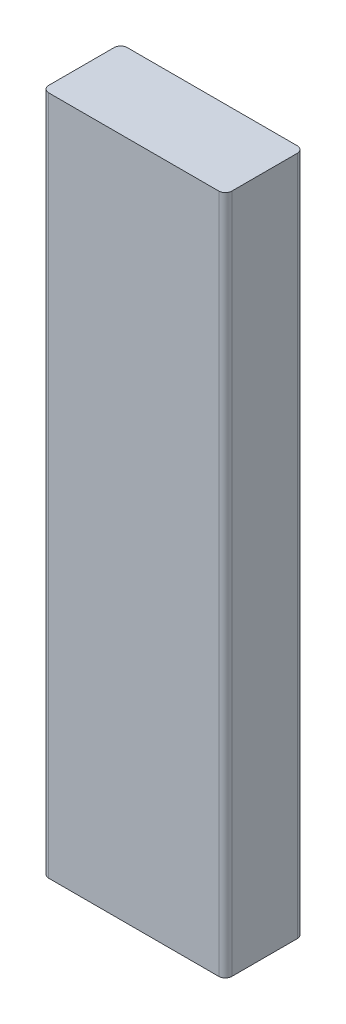
ISO-10303-21;
HEADER;
FILE_DESCRIPTION(('STEP AP214'),'2;1');
FILE_NAME('part.step','',(''),(''),'','','');
FILE_SCHEMA(('AUTOMOTIVE_DESIGN { 1 0 10303 214 1 1 1 1 }'));
ENDSEC;
DATA;
#1=APPLICATION_CONTEXT('core data for automotive mechanical design processes');
#2=APPLICATION_PROTOCOL_DEFINITION('international standard','automotive_design',2000,#1);
#3=PRODUCT_CONTEXT('',#1,'mechanical');
#4=PRODUCT('Part','Part','',(#3));
#5=PRODUCT_RELATED_PRODUCT_CATEGORY('part','',(#4));
#6=PRODUCT_DEFINITION_FORMATION('','',#4);
#7=PRODUCT_DEFINITION_CONTEXT('part definition',#1,'design');
#8=PRODUCT_DEFINITION('design','',#6,#7);
#9=PRODUCT_DEFINITION_SHAPE('','',#8);
#10=(LENGTH_UNIT() NAMED_UNIT(*) SI_UNIT(.MILLI.,.METRE.));
#11=(NAMED_UNIT(*) PLANE_ANGLE_UNIT() SI_UNIT($,.RADIAN.));
#12=(NAMED_UNIT(*) SI_UNIT($,.STERADIAN.) SOLID_ANGLE_UNIT());
#13=UNCERTAINTY_MEASURE_WITH_UNIT(LENGTH_MEASURE(1.E-05),#10,'distance_accuracy_value','');
#14=(GEOMETRIC_REPRESENTATION_CONTEXT(3) GLOBAL_UNCERTAINTY_ASSIGNED_CONTEXT((#13)) GLOBAL_UNIT_ASSIGNED_CONTEXT((#10,
#11,#12)) REPRESENTATION_CONTEXT('',''));
#15=CARTESIAN_POINT('',(0.,0.,0.));
#16=DIRECTION('',(0.,0.,1.));
#17=DIRECTION('',(1.,0.,0.));
#18=AXIS2_PLACEMENT_3D('',#15,#16,#17);
#19=CARTESIAN_POINT('',(-41.275,330.2,15.875));
#20=DIRECTION('',(0.,-1.,0.));
#21=DIRECTION('',(0.,0.,-1.));
#22=AXIS2_PLACEMENT_3D('',#19,#20,#21);
#23=CYLINDRICAL_SURFACE('',#22,3.17499999999999);
#24=CARTESIAN_POINT('',(-41.275,0.,15.875));
#25=DIRECTION('',(0.,1.,0.));
#26=DIRECTION('',(0.,0.,-1.));
#27=AXIS2_PLACEMENT_3D('',#24,#25,#26);
#28=CIRCLE('',#27,3.17499999999999);
#29=CARTESIAN_POINT('',(-44.45,0.,15.875));
#30=VERTEX_POINT('',#29);
#31=CARTESIAN_POINT('',(-41.275,0.,19.05));
#32=VERTEX_POINT('',#31);
#33=EDGE_CURVE('E140',#30,#32,#28,.T.);
#34=ORIENTED_EDGE('',*,*,#33,.T.);
#35=DIRECTION('',(0.,-1.,0.));
#36=VECTOR('',#35,1.);
#37=CARTESIAN_POINT('',(-41.275,330.2,19.05));
#38=LINE('',#37,#36);
#39=CARTESIAN_POINT('',(-41.275,330.2,19.05));
#40=VERTEX_POINT('',#39);
#41=EDGE_CURVE('E11',#40,#32,#38,.T.);
#42=ORIENTED_EDGE('',*,*,#41,.F.);
#43=CARTESIAN_POINT('',(-41.275,330.2,15.875));
#44=DIRECTION('',(0.,1.,0.));
#45=DIRECTION('',(0.,0.,-1.));
#46=AXIS2_PLACEMENT_3D('',#43,#44,#45);
#47=CIRCLE('',#46,3.17499999999999);
#48=CARTESIAN_POINT('',(-44.45,330.2,15.875));
#49=VERTEX_POINT('',#48);
#50=EDGE_CURVE('E162',#49,#40,#47,.T.);
#51=ORIENTED_EDGE('',*,*,#50,.F.);
#52=DIRECTION('',(0.,-1.,0.));
#53=VECTOR('',#52,1.);
#54=CARTESIAN_POINT('',(-44.45,330.2,15.875));
#55=LINE('',#54,#53);
#56=EDGE_CURVE('E136',#49,#30,#55,.T.);
#57=ORIENTED_EDGE('',*,*,#56,.T.);
#58=EDGE_LOOP('',(#34,#42,#51,#57));
#59=FACE_BOUND('',#58,.T.);
#60=ADVANCED_FACE('F39',(#59),#23,.T.);
#61=CARTESIAN_POINT('',(41.275,330.2,19.05));
#62=DIRECTION('',(0.,0.,-1.));
#63=DIRECTION('',(-1.,0.,0.));
#64=AXIS2_PLACEMENT_3D('',#61,#62,#63);
#65=PLANE('',#64);
#66=DIRECTION('',(1.,0.,0.));
#67=VECTOR('',#66,1.);
#68=CARTESIAN_POINT('',(41.275,0.,19.05));
#69=LINE('',#68,#67);
#70=CARTESIAN_POINT('',(41.275,0.,19.05));
#71=VERTEX_POINT('',#70);
#72=EDGE_CURVE('E144',#32,#71,#69,.T.);
#73=ORIENTED_EDGE('',*,*,#72,.T.);
#74=DIRECTION('',(0.,-1.,0.));
#75=VECTOR('',#74,1.);
#76=CARTESIAN_POINT('',(41.275,330.2,19.05));
#77=LINE('',#76,#75);
#78=CARTESIAN_POINT('',(41.275,330.2,19.05));
#79=VERTEX_POINT('',#78);
#80=EDGE_CURVE('E48',#79,#71,#77,.T.);
#81=ORIENTED_EDGE('',*,*,#80,.F.);
#82=DIRECTION('',(1.,0.,0.));
#83=VECTOR('',#82,1.);
#84=CARTESIAN_POINT('',(41.275,330.2,19.05));
#85=LINE('',#84,#83);
#86=EDGE_CURVE('E99',#40,#79,#85,.T.);
#87=ORIENTED_EDGE('',*,*,#86,.F.);
#88=ORIENTED_EDGE('',*,*,#41,.T.);
#89=EDGE_LOOP('',(#73,#81,#87,#88));
#90=FACE_BOUND('',#89,.T.);
#91=ADVANCED_FACE('F208',(#90),#65,.F.);
#92=CARTESIAN_POINT('',(41.275,330.2,15.875));
#93=DIRECTION('',(0.,-1.,0.));
#94=DIRECTION('',(0.,0.,-1.));
#95=AXIS2_PLACEMENT_3D('',#92,#93,#94);
#96=CYLINDRICAL_SURFACE('',#95,3.175);
#97=CARTESIAN_POINT('',(41.275,0.,15.875));
#98=DIRECTION('',(0.,1.,0.));
#99=DIRECTION('',(0.,0.,1.));
#100=AXIS2_PLACEMENT_3D('',#97,#98,#99);
#101=CIRCLE('',#100,3.175);
#102=CARTESIAN_POINT('',(44.45,0.,15.875));
#103=VERTEX_POINT('',#102);
#104=EDGE_CURVE('E147',#71,#103,#101,.T.);
#105=ORIENTED_EDGE('',*,*,#104,.T.);
#106=DIRECTION('',(0.,-1.,0.));
#107=VECTOR('',#106,1.);
#108=CARTESIAN_POINT('',(44.45,330.2,15.875));
#109=LINE('',#108,#107);
#110=CARTESIAN_POINT('',(44.45,330.2,15.875));
#111=VERTEX_POINT('',#110);
#112=EDGE_CURVE('E173',#111,#103,#109,.T.);
#113=ORIENTED_EDGE('',*,*,#112,.F.);
#114=CARTESIAN_POINT('',(41.275,330.2,15.875));
#115=DIRECTION('',(0.,1.,0.));
#116=DIRECTION('',(0.,0.,1.));
#117=AXIS2_PLACEMENT_3D('',#114,#115,#116);
#118=CIRCLE('',#117,3.175);
#119=EDGE_CURVE('E183',#79,#111,#118,.T.);
#120=ORIENTED_EDGE('',*,*,#119,.F.);
#121=ORIENTED_EDGE('',*,*,#80,.T.);
#122=EDGE_LOOP('',(#105,#113,#120,#121));
#123=FACE_BOUND('',#122,.T.);
#124=ADVANCED_FACE('F181',(#123),#96,.T.);
#125=CARTESIAN_POINT('',(44.45,330.2,15.875));
#126=DIRECTION('',(-1.,0.,0.));
#127=DIRECTION('',(0.,0.,1.));
#128=AXIS2_PLACEMENT_3D('',#125,#126,#127);
#129=PLANE('',#128);
#130=DIRECTION('',(0.,0.,-1.));
#131=VECTOR('',#130,1.);
#132=CARTESIAN_POINT('',(44.45,0.,15.875));
#133=LINE('',#132,#131);
#134=CARTESIAN_POINT('',(44.45,0.,-15.875));
#135=VERTEX_POINT('',#134);
#136=EDGE_CURVE('E150',#103,#135,#133,.T.);
#137=ORIENTED_EDGE('',*,*,#136,.T.);
#138=DIRECTION('',(0.,-1.,0.));
#139=VECTOR('',#138,1.);
#140=CARTESIAN_POINT('',(44.45,330.2,-15.875));
#141=LINE('',#140,#139);
#142=CARTESIAN_POINT('',(44.45,330.2,-15.875));
#143=VERTEX_POINT('',#142);
#144=EDGE_CURVE('E169',#143,#135,#141,.T.);
#145=ORIENTED_EDGE('',*,*,#144,.F.);
#146=DIRECTION('',(0.,0.,-1.));
#147=VECTOR('',#146,1.);
#148=CARTESIAN_POINT('',(44.45,330.2,15.875));
#149=LINE('',#148,#147);
#150=EDGE_CURVE('E196',#111,#143,#149,.T.);
#151=ORIENTED_EDGE('',*,*,#150,.F.);
#152=ORIENTED_EDGE('',*,*,#112,.T.);
#153=EDGE_LOOP('',(#137,#145,#151,#152));
#154=FACE_BOUND('',#153,.T.);
#155=ADVANCED_FACE('F191',(#154),#129,.F.);
#156=CARTESIAN_POINT('',(41.275,330.2,-15.875));
#157=DIRECTION('',(0.,-1.,0.));
#158=DIRECTION('',(0.,0.,-1.));
#159=AXIS2_PLACEMENT_3D('',#156,#157,#158);
#160=CYLINDRICAL_SURFACE('',#159,3.175);
#161=CARTESIAN_POINT('',(41.275,0.,-15.875));
#162=DIRECTION('',(0.,1.,0.));
#163=DIRECTION('',(0.,0.,1.));
#164=AXIS2_PLACEMENT_3D('',#161,#162,#163);
#165=CIRCLE('',#164,3.175);
#166=CARTESIAN_POINT('',(41.275,0.,-19.05));
#167=VERTEX_POINT('',#166);
#168=EDGE_CURVE('E153',#135,#167,#165,.T.);
#169=ORIENTED_EDGE('',*,*,#168,.T.);
#170=DIRECTION('',(0.,-1.,0.));
#171=VECTOR('',#170,1.);
#172=CARTESIAN_POINT('',(41.275,330.2,-19.05));
#173=LINE('',#172,#171);
#174=CARTESIAN_POINT('',(41.275,330.2,-19.05));
#175=VERTEX_POINT('',#174);
#176=EDGE_CURVE('E129',#175,#167,#173,.T.);
#177=ORIENTED_EDGE('',*,*,#176,.F.);
#178=CARTESIAN_POINT('',(41.275,330.2,-15.875));
#179=DIRECTION('',(0.,1.,0.));
#180=DIRECTION('',(0.,0.,1.));
#181=AXIS2_PLACEMENT_3D('',#178,#179,#180);
#182=CIRCLE('',#181,3.175);
#183=EDGE_CURVE('E118',#143,#175,#182,.T.);
#184=ORIENTED_EDGE('',*,*,#183,.F.);
#185=ORIENTED_EDGE('',*,*,#144,.T.);
#186=EDGE_LOOP('',(#169,#177,#184,#185));
#187=FACE_BOUND('',#186,.T.);
#188=ADVANCED_FACE('F194',(#187),#160,.T.);
#189=CARTESIAN_POINT('',(41.275,330.2,-19.05));
#190=DIRECTION('',(0.,0.,1.));
#191=DIRECTION('',(1.,0.,0.));
#192=AXIS2_PLACEMENT_3D('',#189,#190,#191);
#193=PLANE('',#192);
#194=DIRECTION('',(-1.,0.,0.));
#195=VECTOR('',#194,1.);
#196=CARTESIAN_POINT('',(41.275,0.,-19.05));
#197=LINE('',#196,#195);
#198=CARTESIAN_POINT('',(-41.275,0.,-19.05));
#199=VERTEX_POINT('',#198);
#200=EDGE_CURVE('E127',#167,#199,#197,.T.);
#201=ORIENTED_EDGE('',*,*,#200,.T.);
#202=DIRECTION('',(0.,-1.,0.));
#203=VECTOR('',#202,1.);
#204=CARTESIAN_POINT('',(-41.275,330.2,-19.05));
#205=LINE('',#204,#203);
#206=CARTESIAN_POINT('',(-41.275,330.2,-19.05));
#207=VERTEX_POINT('',#206);
#208=EDGE_CURVE('E124',#207,#199,#205,.T.);
#209=ORIENTED_EDGE('',*,*,#208,.F.);
#210=DIRECTION('',(-1.,0.,0.));
#211=VECTOR('',#210,1.);
#212=CARTESIAN_POINT('',(41.275,330.2,-19.05));
#213=LINE('',#212,#211);
#214=EDGE_CURVE('E112',#175,#207,#213,.T.);
#215=ORIENTED_EDGE('',*,*,#214,.F.);
#216=ORIENTED_EDGE('',*,*,#176,.T.);
#217=EDGE_LOOP('',(#201,#209,#215,#216));
#218=FACE_BOUND('',#217,.T.);
#219=ADVANCED_FACE('F125',(#218),#193,.F.);
#220=CARTESIAN_POINT('',(-41.275,330.2,-15.875));
#221=DIRECTION('',(0.,-1.,0.));
#222=DIRECTION('',(0.,0.,-1.));
#223=AXIS2_PLACEMENT_3D('',#220,#221,#222);
#224=CYLINDRICAL_SURFACE('',#223,3.17500000000001);
#225=CARTESIAN_POINT('',(-41.275,0.,-15.875));
#226=DIRECTION('',(0.,1.,0.));
#227=DIRECTION('',(0.,0.,1.));
#228=AXIS2_PLACEMENT_3D('',#225,#226,#227);
#229=CIRCLE('',#228,3.17500000000001);
#230=CARTESIAN_POINT('',(-44.45,0.,-15.875));
#231=VERTEX_POINT('',#230);
#232=EDGE_CURVE('E85',#199,#231,#229,.T.);
#233=ORIENTED_EDGE('',*,*,#232,.T.);
#234=DIRECTION('',(0.,-1.,0.));
#235=VECTOR('',#234,1.);
#236=CARTESIAN_POINT('',(-44.45,330.2,-15.875));
#237=LINE('',#236,#235);
#238=CARTESIAN_POINT('',(-44.45,330.2,-15.875));
#239=VERTEX_POINT('',#238);
#240=EDGE_CURVE('E130',#239,#231,#237,.T.);
#241=ORIENTED_EDGE('',*,*,#240,.F.);
#242=CARTESIAN_POINT('',(-41.275,330.2,-15.875));
#243=DIRECTION('',(0.,1.,0.));
#244=DIRECTION('',(0.,0.,1.));
#245=AXIS2_PLACEMENT_3D('',#242,#243,#244);
#246=CIRCLE('',#245,3.17500000000001);
#247=EDGE_CURVE('E116',#207,#239,#246,.T.);
#248=ORIENTED_EDGE('',*,*,#247,.F.);
#249=ORIENTED_EDGE('',*,*,#208,.T.);
#250=EDGE_LOOP('',(#233,#241,#248,#249));
#251=FACE_BOUND('',#250,.T.);
#252=ADVANCED_FACE('F132',(#251),#224,.T.);
#253=CARTESIAN_POINT('',(-44.45,330.2,15.875));
#254=DIRECTION('',(1.,0.,0.));
#255=DIRECTION('',(0.,0.,-1.));
#256=AXIS2_PLACEMENT_3D('',#253,#254,#255);
#257=PLANE('',#256);
#258=DIRECTION('',(0.,0.,1.));
#259=VECTOR('',#258,1.);
#260=CARTESIAN_POINT('',(-44.45,0.,15.875));
#261=LINE('',#260,#259);
#262=EDGE_CURVE('E91',#231,#30,#261,.T.);
#263=ORIENTED_EDGE('',*,*,#262,.T.);
#264=ORIENTED_EDGE('',*,*,#56,.F.);
#265=DIRECTION('',(0.,0.,1.));
#266=VECTOR('',#265,1.);
#267=CARTESIAN_POINT('',(-44.45,330.2,15.875));
#268=LINE('',#267,#266);
#269=EDGE_CURVE('E56',#239,#49,#268,.T.);
#270=ORIENTED_EDGE('',*,*,#269,.F.);
#271=ORIENTED_EDGE('',*,*,#240,.T.);
#272=EDGE_LOOP('',(#263,#264,#270,#271));
#273=FACE_BOUND('',#272,.T.);
#274=ADVANCED_FACE('F224',(#273),#257,.F.);
#275=CARTESIAN_POINT('',(-41.275,330.2,15.875));
#276=DIRECTION('',(0.,-1.,0.));
#277=DIRECTION('',(0.,0.,-1.));
#278=AXIS2_PLACEMENT_3D('',#275,#276,#277);
#279=PLANE('',#278);
#280=ORIENTED_EDGE('',*,*,#50,.T.);
#281=ORIENTED_EDGE('',*,*,#86,.T.);
#282=ORIENTED_EDGE('',*,*,#119,.T.);
#283=ORIENTED_EDGE('',*,*,#150,.T.);
#284=ORIENTED_EDGE('',*,*,#183,.T.);
#285=ORIENTED_EDGE('',*,*,#214,.T.);
#286=ORIENTED_EDGE('',*,*,#247,.T.);
#287=ORIENTED_EDGE('',*,*,#269,.T.);
#288=EDGE_LOOP('',(#280,#281,#282,#283,#284,#285,#286,#287));
#289=FACE_BOUND('',#288,.T.);
#290=ADVANCED_FACE('F114',(#289),#279,.F.);
#291=CARTESIAN_POINT('',(-41.275,0.,15.875));
#292=DIRECTION('',(0.,-1.,0.));
#293=DIRECTION('',(0.,0.,-1.));
#294=AXIS2_PLACEMENT_3D('',#291,#292,#293);
#295=PLANE('',#294);
#296=ORIENTED_EDGE('',*,*,#33,.F.);
#297=ORIENTED_EDGE('',*,*,#262,.F.);
#298=ORIENTED_EDGE('',*,*,#232,.F.);
#299=ORIENTED_EDGE('',*,*,#200,.F.);
#300=ORIENTED_EDGE('',*,*,#168,.F.);
#301=ORIENTED_EDGE('',*,*,#136,.F.);
#302=ORIENTED_EDGE('',*,*,#104,.F.);
#303=ORIENTED_EDGE('',*,*,#72,.F.);
#304=EDGE_LOOP('',(#296,#297,#298,#299,#300,#301,#302,#303));
#305=FACE_BOUND('',#304,.T.);
#306=ADVANCED_FACE('F187',(#305),#295,.T.);
#307=CLOSED_SHELL('',(#60,#91,#124,#155,#188,#219,#252,#274,#290,#306));
#308=MANIFOLD_SOLID_BREP('B2',#307);
#309=ADVANCED_BREP_SHAPE_REPRESENTATION('',(#18,#308),#14);
#310=SHAPE_DEFINITION_REPRESENTATION(#9,#309);
ENDSEC;
END-ISO-10303-21;
